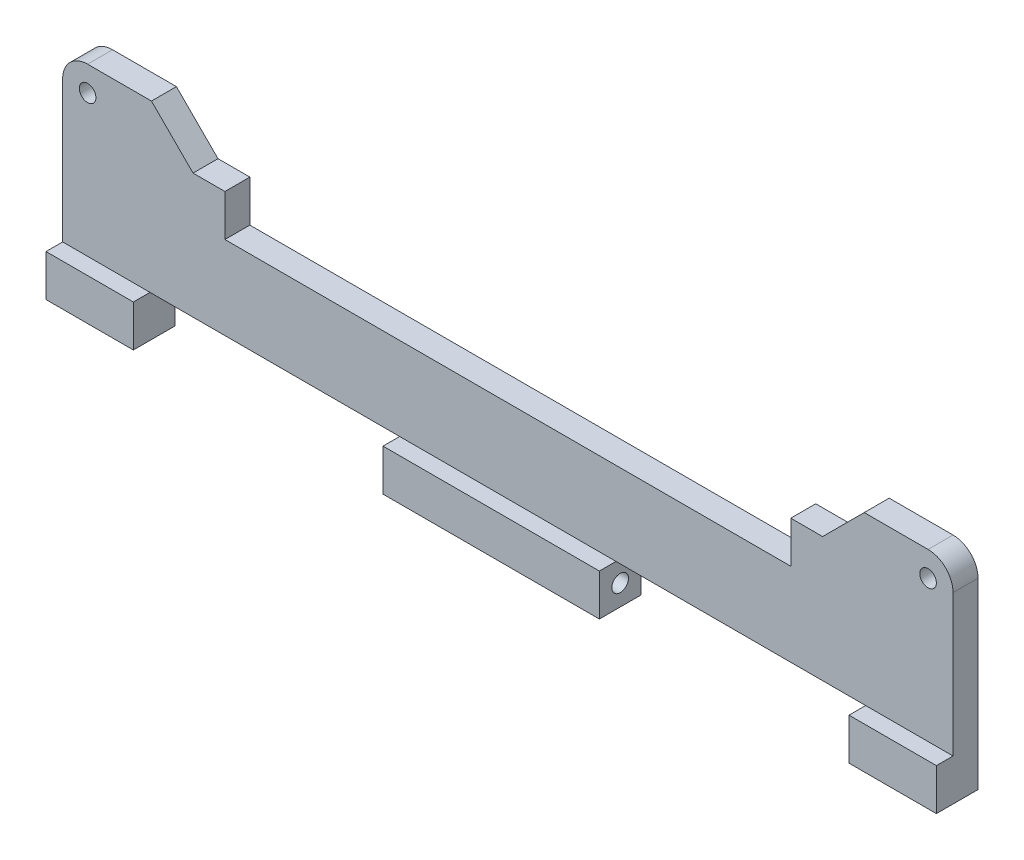
ISO-10303-21;
HEADER;
FILE_DESCRIPTION(('STEP AP214'),'2;1');
FILE_NAME('part.step','',(''),(''),'','','');
FILE_SCHEMA(('AUTOMOTIVE_DESIGN { 1 0 10303 214 1 1 1 1 }'));
ENDSEC;
DATA;
#1=APPLICATION_CONTEXT('core data for automotive mechanical design processes');
#2=APPLICATION_PROTOCOL_DEFINITION('international standard','automotive_design',2000,#1);
#3=PRODUCT_CONTEXT('',#1,'mechanical');
#4=PRODUCT('Part','Part','',(#3));
#5=PRODUCT_RELATED_PRODUCT_CATEGORY('part','',(#4));
#6=PRODUCT_DEFINITION_FORMATION('','',#4);
#7=PRODUCT_DEFINITION_CONTEXT('part definition',#1,'design');
#8=PRODUCT_DEFINITION('design','',#6,#7);
#9=PRODUCT_DEFINITION_SHAPE('','',#8);
#10=(LENGTH_UNIT() NAMED_UNIT(*) SI_UNIT(.MILLI.,.METRE.));
#11=(NAMED_UNIT(*) PLANE_ANGLE_UNIT() SI_UNIT($,.RADIAN.));
#12=(NAMED_UNIT(*) SI_UNIT($,.STERADIAN.) SOLID_ANGLE_UNIT());
#13=UNCERTAINTY_MEASURE_WITH_UNIT(LENGTH_MEASURE(1.E-05),#10,'distance_accuracy_value','');
#14=(GEOMETRIC_REPRESENTATION_CONTEXT(3) GLOBAL_UNCERTAINTY_ASSIGNED_CONTEXT((#13)) GLOBAL_UNIT_ASSIGNED_CONTEXT((#10,
#11,#12)) REPRESENTATION_CONTEXT('',''));
#15=CARTESIAN_POINT('',(0.,0.,0.));
#16=DIRECTION('',(0.,0.,1.));
#17=DIRECTION('',(1.,0.,0.));
#18=AXIS2_PLACEMENT_3D('',#15,#16,#17);
#19=CARTESIAN_POINT('',(-16.5,10.,5.));
#20=DIRECTION('',(0.,-1.,0.));
#21=DIRECTION('',(0.,0.,-1.));
#22=AXIS2_PLACEMENT_3D('',#19,#20,#21);
#23=PLANE('',#22);
#24=DIRECTION('',(-1.,0.,0.));
#25=VECTOR('',#24,1.);
#26=CARTESIAN_POINT('',(-16.5,10.,0.));
#27=LINE('',#26,#25);
#28=CARTESIAN_POINT('',(74.8269189439482,10.,0.));
#29=VERTEX_POINT('',#28);
#30=CARTESIAN_POINT('',(71.,10.,0.));
#31=VERTEX_POINT('',#30);
#32=EDGE_CURVE('E379',#29,#31,#27,.T.);
#33=ORIENTED_EDGE('',*,*,#32,.T.);
#34=DIRECTION('',(0.,0.,-1.));
#35=VECTOR('',#34,1.);
#36=CARTESIAN_POINT('',(71.,10.,3.));
#37=LINE('',#36,#35);
#38=CARTESIAN_POINT('',(71.,10.,3.));
#39=VERTEX_POINT('',#38);
#40=EDGE_CURVE('E215',#39,#31,#37,.T.);
#41=ORIENTED_EDGE('',*,*,#40,.F.);
#42=DIRECTION('',(-1.,0.,0.));
#43=VECTOR('',#42,1.);
#44=CARTESIAN_POINT('',(0.,10.,3.));
#45=LINE('',#44,#43);
#46=CARTESIAN_POINT('',(74.8269189439482,10.,3.));
#47=VERTEX_POINT('',#46);
#48=EDGE_CURVE('E356',#47,#39,#45,.T.);
#49=ORIENTED_EDGE('',*,*,#48,.F.);
#50=DIRECTION('',(0.,0.,-1.));
#51=VECTOR('',#50,1.);
#52=CARTESIAN_POINT('',(74.8269189439482,10.,5.));
#53=LINE('',#52,#51);
#54=EDGE_CURVE('E376',#47,#29,#53,.T.);
#55=ORIENTED_EDGE('',*,*,#54,.T.);
#56=EDGE_LOOP('',(#33,#41,#49,#55));
#57=FACE_BOUND('',#56,.T.);
#58=ADVANCED_FACE('F35',(#57),#23,.F.);
#59=CARTESIAN_POINT('',(0.,0.,0.));
#60=DIRECTION('',(0.,0.,-1.));
#61=DIRECTION('',(-1.,0.,0.));
#62=AXIS2_PLACEMENT_3D('',#59,#60,#61);
#63=PLANE('',#62);
#64=DIRECTION('',(0.,1.,0.));
#65=VECTOR('',#64,1.);
#66=CARTESIAN_POINT('',(71.,5.,0.));
#67=LINE('',#66,#65);
#68=CARTESIAN_POINT('',(71.,5.,0.));
#69=VERTEX_POINT('',#68);
#70=EDGE_CURVE('E209',#69,#31,#67,.T.);
#71=ORIENTED_EDGE('',*,*,#70,.T.);
#72=ORIENTED_EDGE('',*,*,#32,.F.);
#73=DIRECTION('',(0.707106781186544,0.707106781186552,0.));
#74=VECTOR('',#73,1.);
#75=CARTESIAN_POINT('',(74.8269189439482,10.,0.));
#76=LINE('',#75,#74);
#77=CARTESIAN_POINT('',(79.8269189439482,15.,0.));
#78=VERTEX_POINT('',#77);
#79=EDGE_CURVE('E373',#29,#78,#76,.T.);
#80=ORIENTED_EDGE('',*,*,#79,.T.);
#81=DIRECTION('',(1.,0.,0.));
#82=VECTOR('',#81,1.);
#83=CARTESIAN_POINT('',(90.5,15.,0.));
#84=LINE('',#83,#82);
#85=CARTESIAN_POINT('',(87.5,15.,0.));
#86=VERTEX_POINT('',#85);
#87=EDGE_CURVE('E251',#78,#86,#84,.T.);
#88=ORIENTED_EDGE('',*,*,#87,.T.);
#89=CARTESIAN_POINT('',(87.5,12.,0.));
#90=DIRECTION('',(0.,0.,-1.));
#91=DIRECTION('',(-1.,0.,0.));
#92=AXIS2_PLACEMENT_3D('',#89,#90,#91);
#93=CIRCLE('',#92,3.);
#94=CARTESIAN_POINT('',(90.5,12.,0.));
#95=VERTEX_POINT('',#94);
#96=EDGE_CURVE('E11',#86,#95,#93,.T.);
#97=ORIENTED_EDGE('',*,*,#96,.T.);
#98=DIRECTION('',(0.,-1.,0.));
#99=VECTOR('',#98,1.);
#100=CARTESIAN_POINT('',(90.5,-10.,0.));
#101=LINE('',#100,#99);
#102=CARTESIAN_POINT('',(90.5,-10.,0.));
#103=VERTEX_POINT('',#102);
#104=EDGE_CURVE('E269',#95,#103,#101,.T.);
#105=ORIENTED_EDGE('',*,*,#104,.T.);
#106=DIRECTION('',(-1.,0.,0.));
#107=VECTOR('',#106,1.);
#108=CARTESIAN_POINT('',(90.5,-10.,0.));
#109=LINE('',#108,#107);
#110=CARTESIAN_POINT('',(80.,-10.,0.));
#111=VERTEX_POINT('',#110);
#112=EDGE_CURVE('E273',#103,#111,#109,.T.);
#113=ORIENTED_EDGE('',*,*,#112,.T.);
#114=DIRECTION('',(0.,1.,0.));
#115=VECTOR('',#114,1.);
#116=CARTESIAN_POINT('',(80.,-10.,0.));
#117=LINE('',#116,#115);
#118=CARTESIAN_POINT('',(80.,-5.,0.));
#119=VERTEX_POINT('',#118);
#120=EDGE_CURVE('E284',#111,#119,#117,.T.);
#121=ORIENTED_EDGE('',*,*,#120,.T.);
#122=DIRECTION('',(-1.,0.,0.));
#123=VECTOR('',#122,1.);
#124=CARTESIAN_POINT('',(80.,-5.,0.));
#125=LINE('',#124,#123);
#126=CARTESIAN_POINT('',(50.,-5.,0.));
#127=VERTEX_POINT('',#126);
#128=EDGE_CURVE('E281',#119,#127,#125,.T.);
#129=ORIENTED_EDGE('',*,*,#128,.T.);
#130=DIRECTION('',(0.,1.,0.));
#131=VECTOR('',#130,1.);
#132=CARTESIAN_POINT('',(50.,-10.,0.));
#133=LINE('',#132,#131);
#134=CARTESIAN_POINT('',(50.,-10.,0.));
#135=VERTEX_POINT('',#134);
#136=EDGE_CURVE('E323',#135,#127,#133,.T.);
#137=ORIENTED_EDGE('',*,*,#136,.F.);
#138=DIRECTION('',(1.,0.,0.));
#139=VECTOR('',#138,1.);
#140=CARTESIAN_POINT('',(24.,-10.,0.));
#141=LINE('',#140,#139);
#142=CARTESIAN_POINT('',(24.,-10.,0.));
#143=VERTEX_POINT('',#142);
#144=EDGE_CURVE('E321',#143,#135,#141,.T.);
#145=ORIENTED_EDGE('',*,*,#144,.F.);
#146=DIRECTION('',(0.,1.,0.));
#147=VECTOR('',#146,1.);
#148=CARTESIAN_POINT('',(24.,-10.,0.));
#149=LINE('',#148,#147);
#150=CARTESIAN_POINT('',(24.,-5.,0.));
#151=VERTEX_POINT('',#150);
#152=EDGE_CURVE('E333',#143,#151,#149,.T.);
#153=ORIENTED_EDGE('',*,*,#152,.T.);
#154=DIRECTION('',(1.,0.,0.));
#155=VECTOR('',#154,1.);
#156=CARTESIAN_POINT('',(-6.,-5.,0.));
#157=LINE('',#156,#155);
#158=CARTESIAN_POINT('',(-6.,-5.,0.));
#159=VERTEX_POINT('',#158);
#160=EDGE_CURVE('E384',#159,#151,#157,.T.);
#161=ORIENTED_EDGE('',*,*,#160,.F.);
#162=DIRECTION('',(0.,1.,0.));
#163=VECTOR('',#162,1.);
#164=CARTESIAN_POINT('',(-6.,-10.,0.));
#165=LINE('',#164,#163);
#166=CARTESIAN_POINT('',(-6.,-10.,0.));
#167=VERTEX_POINT('',#166);
#168=EDGE_CURVE('E505',#167,#159,#165,.T.);
#169=ORIENTED_EDGE('',*,*,#168,.F.);
#170=DIRECTION('',(1.,0.,0.));
#171=VECTOR('',#170,1.);
#172=CARTESIAN_POINT('',(-16.5,-10.,0.));
#173=LINE('',#172,#171);
#174=CARTESIAN_POINT('',(-16.5,-10.,0.));
#175=VERTEX_POINT('',#174);
#176=EDGE_CURVE('E496',#175,#167,#173,.T.);
#177=ORIENTED_EDGE('',*,*,#176,.F.);
#178=DIRECTION('',(0.,-1.,0.));
#179=VECTOR('',#178,1.);
#180=CARTESIAN_POINT('',(-16.5,-10.,0.));
#181=LINE('',#180,#179);
#182=CARTESIAN_POINT('',(-16.5,12.,0.));
#183=VERTEX_POINT('',#182);
#184=EDGE_CURVE('E491',#183,#175,#181,.T.);
#185=ORIENTED_EDGE('',*,*,#184,.F.);
#186=CARTESIAN_POINT('',(-13.5,12.,0.));
#187=DIRECTION('',(0.,0.,-1.));
#188=DIRECTION('',(-1.,0.,0.));
#189=AXIS2_PLACEMENT_3D('',#186,#187,#188);
#190=CIRCLE('',#189,3.);
#191=CARTESIAN_POINT('',(-13.5,15.,0.));
#192=VERTEX_POINT('',#191);
#193=EDGE_CURVE('E378',#183,#192,#190,.T.);
#194=ORIENTED_EDGE('',*,*,#193,.T.);
#195=DIRECTION('',(-1.,0.,0.));
#196=VECTOR('',#195,1.);
#197=CARTESIAN_POINT('',(-16.5,15.,0.));
#198=LINE('',#197,#196);
#199=CARTESIAN_POINT('',(-5.82691894394815,15.,0.));
#200=VERTEX_POINT('',#199);
#201=EDGE_CURVE('E303',#200,#192,#198,.T.);
#202=ORIENTED_EDGE('',*,*,#201,.F.);
#203=DIRECTION('',(-0.707106781186544,0.707106781186551,0.));
#204=VECTOR('',#203,1.);
#205=CARTESIAN_POINT('',(-10.8269189439483,20.0000000000002,0.));
#206=LINE('',#205,#204);
#207=CARTESIAN_POINT('',(-0.826918943948207,10.,0.));
#208=VERTEX_POINT('',#207);
#209=EDGE_CURVE('E402',#200,#208,#206,.F.);
#210=ORIENTED_EDGE('',*,*,#209,.T.);
#211=CARTESIAN_POINT('',(2.99999999999998,10.,0.));
#212=VERTEX_POINT('',#211);
#213=EDGE_CURVE('E39',#212,#208,#27,.T.);
#214=ORIENTED_EDGE('',*,*,#213,.F.);
#215=DIRECTION('',(0.,1.,0.));
#216=VECTOR('',#215,1.);
#217=CARTESIAN_POINT('',(2.99999999999998,5.,0.));
#218=LINE('',#217,#216);
#219=CARTESIAN_POINT('',(2.99999999999998,5.,0.));
#220=VERTEX_POINT('',#219);
#221=EDGE_CURVE('E53',#220,#212,#218,.T.);
#222=ORIENTED_EDGE('',*,*,#221,.F.);
#223=DIRECTION('',(-1.,0.,0.));
#224=VECTOR('',#223,1.);
#225=CARTESIAN_POINT('',(2.99999999999998,5.,0.));
#226=LINE('',#225,#224);
#227=EDGE_CURVE('E226',#69,#220,#226,.T.);
#228=ORIENTED_EDGE('',*,*,#227,.F.);
#229=EDGE_LOOP('',(#71,#72,#80,#88,#97,#105,#113,#121,#129,#137,#145,#153,#161,#169,#177,#185,
#194,#202,#210,#214,#222,#228));
#230=FACE_BOUND('',#229,.T.);
#231=CARTESIAN_POINT('',(-13.5,12.,0.));
#232=DIRECTION('',(0.,0.,-1.));
#233=DIRECTION('',(-1.,0.,0.));
#234=AXIS2_PLACEMENT_3D('',#231,#232,#233);
#235=CIRCLE('',#234,1.);
#236=CARTESIAN_POINT('',(-14.5,12.,0.));
#237=VERTEX_POINT('',#236);
#238=EDGE_CURVE('E297',#237,#237,#235,.T.);
#239=ORIENTED_EDGE('',*,*,#238,.F.);
#240=EDGE_LOOP('',(#239));
#241=FACE_BOUND('',#240,.T.);
#242=CARTESIAN_POINT('',(87.5,12.,0.));
#243=DIRECTION('',(0.,0.,1.));
#244=DIRECTION('',(1.,0.,0.));
#245=AXIS2_PLACEMENT_3D('',#242,#243,#244);
#246=CIRCLE('',#245,1.);
#247=CARTESIAN_POINT('',(88.5,12.,0.));
#248=VERTEX_POINT('',#247);
#249=EDGE_CURVE('E243',#248,#248,#246,.T.);
#250=ORIENTED_EDGE('',*,*,#249,.T.);
#251=EDGE_LOOP('',(#250));
#252=FACE_BOUND('',#251,.T.);
#253=ADVANCED_FACE('F231',(#230,#241,#252),#63,.T.);
#254=CARTESIAN_POINT('',(0.,0.,3.));
#255=DIRECTION('',(0.,0.,1.));
#256=DIRECTION('',(1.,0.,0.));
#257=AXIS2_PLACEMENT_3D('',#254,#255,#256);
#258=PLANE('',#257);
#259=DIRECTION('',(0.,1.,0.));
#260=VECTOR('',#259,1.);
#261=CARTESIAN_POINT('',(71.,5.,3.));
#262=LINE('',#261,#260);
#263=CARTESIAN_POINT('',(71.,5.,3.));
#264=VERTEX_POINT('',#263);
#265=EDGE_CURVE('E241',#264,#39,#262,.T.);
#266=ORIENTED_EDGE('',*,*,#265,.F.);
#267=DIRECTION('',(1.,0.,0.));
#268=VECTOR('',#267,1.);
#269=CARTESIAN_POINT('',(2.99999999999998,5.,3.));
#270=LINE('',#269,#268);
#271=CARTESIAN_POINT('',(2.99999999999998,5.,3.));
#272=VERTEX_POINT('',#271);
#273=EDGE_CURVE('E220',#272,#264,#270,.T.);
#274=ORIENTED_EDGE('',*,*,#273,.F.);
#275=DIRECTION('',(0.,1.,0.));
#276=VECTOR('',#275,1.);
#277=CARTESIAN_POINT('',(2.99999999999998,5.,3.));
#278=LINE('',#277,#276);
#279=CARTESIAN_POINT('',(2.99999999999998,10.,3.));
#280=VERTEX_POINT('',#279);
#281=EDGE_CURVE('E244',#272,#280,#278,.T.);
#282=ORIENTED_EDGE('',*,*,#281,.T.);
#283=CARTESIAN_POINT('',(-0.8269189439482,10.,3.));
#284=VERTEX_POINT('',#283);
#285=EDGE_CURVE('E349',#280,#284,#45,.T.);
#286=ORIENTED_EDGE('',*,*,#285,.T.);
#287=DIRECTION('',(0.707106781186544,-0.707106781186551,0.));
#288=VECTOR('',#287,1.);
#289=CARTESIAN_POINT('',(-10.8269189439483,20.0000000000002,3.));
#290=LINE('',#289,#288);
#291=CARTESIAN_POINT('',(-5.82691894394815,15.,3.));
#292=VERTEX_POINT('',#291);
#293=EDGE_CURVE('E405',#284,#292,#290,.F.);
#294=ORIENTED_EDGE('',*,*,#293,.T.);
#295=DIRECTION('',(1.,0.,0.));
#296=VECTOR('',#295,1.);
#297=CARTESIAN_POINT('',(-16.5,15.,3.));
#298=LINE('',#297,#296);
#299=CARTESIAN_POINT('',(-13.5,15.,3.));
#300=VERTEX_POINT('',#299);
#301=EDGE_CURVE('E301',#300,#292,#298,.T.);
#302=ORIENTED_EDGE('',*,*,#301,.F.);
#303=CARTESIAN_POINT('',(-13.5,12.,3.));
#304=DIRECTION('',(0.,0.,1.));
#305=DIRECTION('',(1.,0.,0.));
#306=AXIS2_PLACEMENT_3D('',#303,#304,#305);
#307=CIRCLE('',#306,3.);
#308=CARTESIAN_POINT('',(-16.5,12.,3.));
#309=VERTEX_POINT('',#308);
#310=EDGE_CURVE('E411',#300,#309,#307,.T.);
#311=ORIENTED_EDGE('',*,*,#310,.T.);
#312=DIRECTION('',(0.,-1.,0.));
#313=VECTOR('',#312,1.);
#314=CARTESIAN_POINT('',(-16.5,0.,3.));
#315=LINE('',#314,#313);
#316=CARTESIAN_POINT('',(-16.5,-5.,3.));
#317=VERTEX_POINT('',#316);
#318=EDGE_CURVE('E343',#309,#317,#315,.T.);
#319=ORIENTED_EDGE('',*,*,#318,.T.);
#320=DIRECTION('',(1.,0.,0.));
#321=VECTOR('',#320,1.);
#322=CARTESIAN_POINT('',(0.,-5.,3.));
#323=LINE('',#322,#321);
#324=CARTESIAN_POINT('',(-6.,-5.,3.));
#325=VERTEX_POINT('',#324);
#326=EDGE_CURVE('E346',#317,#325,#323,.T.);
#327=ORIENTED_EDGE('',*,*,#326,.T.);
#328=CARTESIAN_POINT('',(24.,-5.,3.));
#329=VERTEX_POINT('',#328);
#330=EDGE_CURVE('E350',#325,#329,#323,.T.);
#331=ORIENTED_EDGE('',*,*,#330,.T.);
#332=CARTESIAN_POINT('',(50.,-5.,3.));
#333=VERTEX_POINT('',#332);
#334=EDGE_CURVE('E345',#329,#333,#323,.T.);
#335=ORIENTED_EDGE('',*,*,#334,.T.);
#336=DIRECTION('',(-1.,0.,0.));
#337=VECTOR('',#336,1.);
#338=CARTESIAN_POINT('',(74.,-5.,3.));
#339=LINE('',#338,#337);
#340=CARTESIAN_POINT('',(80.,-5.,3.));
#341=VERTEX_POINT('',#340);
#342=EDGE_CURVE('E258',#341,#333,#339,.T.);
#343=ORIENTED_EDGE('',*,*,#342,.F.);
#344=CARTESIAN_POINT('',(90.5,-5.,3.));
#345=VERTEX_POINT('',#344);
#346=EDGE_CURVE('E259',#345,#341,#339,.T.);
#347=ORIENTED_EDGE('',*,*,#346,.F.);
#348=DIRECTION('',(0.,-1.,0.));
#349=VECTOR('',#348,1.);
#350=CARTESIAN_POINT('',(90.5,0.,3.));
#351=LINE('',#350,#349);
#352=CARTESIAN_POINT('',(90.5,12.,3.));
#353=VERTEX_POINT('',#352);
#354=EDGE_CURVE('E256',#353,#345,#351,.T.);
#355=ORIENTED_EDGE('',*,*,#354,.F.);
#356=CARTESIAN_POINT('',(87.5,12.,3.));
#357=DIRECTION('',(0.,0.,1.));
#358=DIRECTION('',(1.,0.,0.));
#359=AXIS2_PLACEMENT_3D('',#356,#357,#358);
#360=CIRCLE('',#359,3.);
#361=CARTESIAN_POINT('',(87.5,15.,3.));
#362=VERTEX_POINT('',#361);
#363=EDGE_CURVE('E363',#353,#362,#360,.T.);
#364=ORIENTED_EDGE('',*,*,#363,.T.);
#365=DIRECTION('',(-1.,0.,0.));
#366=VECTOR('',#365,1.);
#367=CARTESIAN_POINT('',(90.5,15.,3.));
#368=LINE('',#367,#366);
#369=CARTESIAN_POINT('',(79.8269189439482,15.,3.));
#370=VERTEX_POINT('',#369);
#371=EDGE_CURVE('E253',#362,#370,#368,.T.);
#372=ORIENTED_EDGE('',*,*,#371,.T.);
#373=DIRECTION('',(-0.707106781186544,-0.707106781186552,0.));
#374=VECTOR('',#373,1.);
#375=CARTESIAN_POINT('',(74.8269189439482,10.,3.));
#376=LINE('',#375,#374);
#377=EDGE_CURVE('E368',#370,#47,#376,.T.);
#378=ORIENTED_EDGE('',*,*,#377,.T.);
#379=ORIENTED_EDGE('',*,*,#48,.T.);
#380=EDGE_LOOP('',(#266,#274,#282,#286,#294,#302,#311,#319,#327,#331,#335,#343,#347,#355,#364,
#372,#378,#379));
#381=FACE_BOUND('',#380,.T.);
#382=CARTESIAN_POINT('',(-13.5,12.,3.));
#383=DIRECTION('',(0.,0.,1.));
#384=DIRECTION('',(1.,0.,0.));
#385=AXIS2_PLACEMENT_3D('',#382,#383,#384);
#386=CIRCLE('',#385,1.);
#387=CARTESIAN_POINT('',(-12.5,12.,3.));
#388=VERTEX_POINT('',#387);
#389=EDGE_CURVE('E300',#388,#388,#386,.T.);
#390=ORIENTED_EDGE('',*,*,#389,.F.);
#391=EDGE_LOOP('',(#390));
#392=FACE_BOUND('',#391,.T.);
#393=CARTESIAN_POINT('',(87.5,12.,3.));
#394=DIRECTION('',(0.,0.,1.));
#395=DIRECTION('',(1.,0.,0.));
#396=AXIS2_PLACEMENT_3D('',#393,#394,#395);
#397=CIRCLE('',#396,1.);
#398=CARTESIAN_POINT('',(88.5,12.,3.));
#399=VERTEX_POINT('',#398);
#400=EDGE_CURVE('E250',#399,#399,#397,.F.);
#401=ORIENTED_EDGE('',*,*,#400,.T.);
#402=EDGE_LOOP('',(#401));
#403=FACE_BOUND('',#402,.T.);
#404=ADVANCED_FACE('F421',(#381,#392,#403),#258,.T.);
#405=ORIENTED_EDGE('',*,*,#285,.F.);
#406=DIRECTION('',(0.,0.,1.));
#407=VECTOR('',#406,1.);
#408=CARTESIAN_POINT('',(2.99999999999998,10.,3.));
#409=LINE('',#408,#407);
#410=EDGE_CURVE('E229',#212,#280,#409,.T.);
#411=ORIENTED_EDGE('',*,*,#410,.F.);
#412=ORIENTED_EDGE('',*,*,#213,.T.);
#413=DIRECTION('',(0.,0.,1.));
#414=VECTOR('',#413,1.);
#415=CARTESIAN_POINT('',(-0.8269189439482,10.,3.));
#416=LINE('',#415,#414);
#417=EDGE_CURVE('E396',#208,#284,#416,.T.);
#418=ORIENTED_EDGE('',*,*,#417,.T.);
#419=EDGE_LOOP('',(#405,#411,#412,#418));
#420=FACE_BOUND('',#419,.T.);
#421=ADVANCED_FACE('F424',(#420),#23,.F.);
#422=CARTESIAN_POINT('',(24.,-10.,5.));
#423=DIRECTION('',(0.,0.,-1.));
#424=DIRECTION('',(-1.,0.,0.));
#425=AXIS2_PLACEMENT_3D('',#422,#423,#424);
#426=PLANE('',#425);
#427=DIRECTION('',(0.,1.,0.));
#428=VECTOR('',#427,1.);
#429=CARTESIAN_POINT('',(50.,-10.,5.));
#430=LINE('',#429,#428);
#431=CARTESIAN_POINT('',(50.,-10.,5.));
#432=VERTEX_POINT('',#431);
#433=CARTESIAN_POINT('',(50.,-5.,5.));
#434=VERTEX_POINT('',#433);
#435=EDGE_CURVE('E339',#432,#434,#430,.T.);
#436=ORIENTED_EDGE('',*,*,#435,.T.);
#437=DIRECTION('',(-1.,0.,0.));
#438=VECTOR('',#437,1.);
#439=CARTESIAN_POINT('',(24.,-5.,5.));
#440=LINE('',#439,#438);
#441=CARTESIAN_POINT('',(24.,-5.,5.));
#442=VERTEX_POINT('',#441);
#443=EDGE_CURVE('E326',#434,#442,#440,.T.);
#444=ORIENTED_EDGE('',*,*,#443,.T.);
#445=DIRECTION('',(0.,1.,0.));
#446=VECTOR('',#445,1.);
#447=CARTESIAN_POINT('',(24.,-10.,5.));
#448=LINE('',#447,#446);
#449=CARTESIAN_POINT('',(24.,-10.,5.));
#450=VERTEX_POINT('',#449);
#451=EDGE_CURVE('E336',#450,#442,#448,.T.);
#452=ORIENTED_EDGE('',*,*,#451,.F.);
#453=DIRECTION('',(-1.,0.,0.));
#454=VECTOR('',#453,1.);
#455=CARTESIAN_POINT('',(24.,-10.,5.));
#456=LINE('',#455,#454);
#457=EDGE_CURVE('E316',#432,#450,#456,.T.);
#458=ORIENTED_EDGE('',*,*,#457,.F.);
#459=EDGE_LOOP('',(#436,#444,#452,#458));
#460=FACE_BOUND('',#459,.T.);
#461=ADVANCED_FACE('F447',(#460),#426,.F.);
#462=DIRECTION('',(-1.,0.,0.));
#463=VECTOR('',#462,1.);
#464=CARTESIAN_POINT('',(74.,-5.,5.));
#465=LINE('',#464,#463);
#466=CARTESIAN_POINT('',(90.5,-5.,5.));
#467=VERTEX_POINT('',#466);
#468=CARTESIAN_POINT('',(80.,-5.,5.));
#469=VERTEX_POINT('',#468);
#470=EDGE_CURVE('E255',#467,#469,#465,.T.);
#471=ORIENTED_EDGE('',*,*,#470,.T.);
#472=DIRECTION('',(0.,1.,0.));
#473=VECTOR('',#472,1.);
#474=CARTESIAN_POINT('',(80.,-10.,5.));
#475=LINE('',#474,#473);
#476=CARTESIAN_POINT('',(80.,-10.,5.));
#477=VERTEX_POINT('',#476);
#478=EDGE_CURVE('E272',#477,#469,#475,.T.);
#479=ORIENTED_EDGE('',*,*,#478,.F.);
#480=DIRECTION('',(-1.,0.,0.));
#481=VECTOR('',#480,1.);
#482=CARTESIAN_POINT('',(90.5,-10.,5.));
#483=LINE('',#482,#481);
#484=CARTESIAN_POINT('',(90.5,-10.,5.));
#485=VERTEX_POINT('',#484);
#486=EDGE_CURVE('E276',#485,#477,#483,.T.);
#487=ORIENTED_EDGE('',*,*,#486,.F.);
#488=DIRECTION('',(0.,-1.,0.));
#489=VECTOR('',#488,1.);
#490=CARTESIAN_POINT('',(90.5,-10.,5.));
#491=LINE('',#490,#489);
#492=EDGE_CURVE('E270',#467,#485,#491,.T.);
#493=ORIENTED_EDGE('',*,*,#492,.F.);
#494=EDGE_LOOP('',(#471,#479,#487,#493));
#495=FACE_BOUND('',#494,.T.);
#496=ADVANCED_FACE('F542',(#495),#426,.F.);
#497=CARTESIAN_POINT('',(80.,-5.,5.));
#498=DIRECTION('',(0.,-1.,0.));
#499=DIRECTION('',(0.,0.,-1.));
#500=AXIS2_PLACEMENT_3D('',#497,#498,#499);
#501=PLANE('',#500);
#502=DIRECTION('',(0.,0.,-1.));
#503=VECTOR('',#502,1.);
#504=CARTESIAN_POINT('',(80.,-5.,5.));
#505=LINE('',#504,#503);
#506=EDGE_CURVE('E293',#341,#119,#505,.T.);
#507=ORIENTED_EDGE('',*,*,#506,.F.);
#508=ORIENTED_EDGE('',*,*,#342,.T.);
#509=DIRECTION('',(0.,0.,1.));
#510=VECTOR('',#509,1.);
#511=CARTESIAN_POINT('',(50.,-5.,0.));
#512=LINE('',#511,#510);
#513=EDGE_CURVE('E312',#127,#333,#512,.T.);
#514=ORIENTED_EDGE('',*,*,#513,.F.);
#515=ORIENTED_EDGE('',*,*,#128,.F.);
#516=EDGE_LOOP('',(#507,#508,#514,#515));
#517=FACE_BOUND('',#516,.T.);
#518=ADVANCED_FACE('F539',(#517),#501,.T.);
#519=CARTESIAN_POINT('',(90.5,-10.,5.));
#520=DIRECTION('',(1.,0.,0.));
#521=DIRECTION('',(0.,0.,-1.));
#522=AXIS2_PLACEMENT_3D('',#519,#520,#521);
#523=PLANE('',#522);
#524=ORIENTED_EDGE('',*,*,#104,.F.);
#525=DIRECTION('',(0.,0.,1.));
#526=VECTOR('',#525,1.);
#527=CARTESIAN_POINT('',(90.5,12.,5.));
#528=LINE('',#527,#526);
#529=EDGE_CURVE('E365',#95,#353,#528,.T.);
#530=ORIENTED_EDGE('',*,*,#529,.T.);
#531=ORIENTED_EDGE('',*,*,#354,.T.);
#532=DIRECTION('',(0.,0.,1.));
#533=VECTOR('',#532,1.);
#534=CARTESIAN_POINT('',(90.5,-5.,3.));
#535=LINE('',#534,#533);
#536=EDGE_CURVE('E261',#345,#467,#535,.T.);
#537=ORIENTED_EDGE('',*,*,#536,.T.);
#538=ORIENTED_EDGE('',*,*,#492,.T.);
#539=DIRECTION('',(0.,0.,-1.));
#540=VECTOR('',#539,1.);
#541=CARTESIAN_POINT('',(90.5,-10.,5.));
#542=LINE('',#541,#540);
#543=EDGE_CURVE('E279',#485,#103,#542,.T.);
#544=ORIENTED_EDGE('',*,*,#543,.T.);
#545=EDGE_LOOP('',(#524,#530,#531,#537,#538,#544));
#546=FACE_BOUND('',#545,.T.);
#547=ADVANCED_FACE('F453',(#546),#523,.T.);
#548=CARTESIAN_POINT('',(-6.,-5.,5.));
#549=DIRECTION('',(0.,1.,0.));
#550=DIRECTION('',(0.,0.,1.));
#551=AXIS2_PLACEMENT_3D('',#548,#549,#550);
#552=PLANE('',#551);
#553=DIRECTION('',(0.,0.,-1.));
#554=VECTOR('',#553,1.);
#555=CARTESIAN_POINT('',(24.,-5.,0.));
#556=LINE('',#555,#554);
#557=EDGE_CURVE('E328',#329,#151,#556,.T.);
#558=ORIENTED_EDGE('',*,*,#557,.F.);
#559=ORIENTED_EDGE('',*,*,#330,.F.);
#560=DIRECTION('',(0.,0.,-1.));
#561=VECTOR('',#560,1.);
#562=CARTESIAN_POINT('',(-6.,-5.,5.));
#563=LINE('',#562,#561);
#564=EDGE_CURVE('E390',#325,#159,#563,.T.);
#565=ORIENTED_EDGE('',*,*,#564,.T.);
#566=ORIENTED_EDGE('',*,*,#160,.T.);
#567=EDGE_LOOP('',(#558,#559,#565,#566));
#568=FACE_BOUND('',#567,.T.);
#569=ADVANCED_FACE('F449',(#568),#552,.F.);
#570=CARTESIAN_POINT('',(-16.5,-10.,5.));
#571=DIRECTION('',(1.,0.,0.));
#572=DIRECTION('',(0.,0.,-1.));
#573=AXIS2_PLACEMENT_3D('',#570,#571,#572);
#574=PLANE('',#573);
#575=ORIENTED_EDGE('',*,*,#318,.F.);
#576=DIRECTION('',(0.,0.,1.));
#577=VECTOR('',#576,1.);
#578=CARTESIAN_POINT('',(-16.5,12.,0.));
#579=LINE('',#578,#577);
#580=EDGE_CURVE('E413',#309,#183,#579,.F.);
#581=ORIENTED_EDGE('',*,*,#580,.T.);
#582=ORIENTED_EDGE('',*,*,#184,.T.);
#583=DIRECTION('',(0.,0.,-1.));
#584=VECTOR('',#583,1.);
#585=CARTESIAN_POINT('',(-16.5,-10.,5.));
#586=LINE('',#585,#584);
#587=CARTESIAN_POINT('',(-16.5,-10.,5.));
#588=VERTEX_POINT('',#587);
#589=EDGE_CURVE('E393',#588,#175,#586,.T.);
#590=ORIENTED_EDGE('',*,*,#589,.F.);
#591=DIRECTION('',(0.,-1.,0.));
#592=VECTOR('',#591,1.);
#593=CARTESIAN_POINT('',(-16.5,-10.,5.));
#594=LINE('',#593,#592);
#595=CARTESIAN_POINT('',(-16.5,-5.,5.));
#596=VERTEX_POINT('',#595);
#597=EDGE_CURVE('E380',#596,#588,#594,.T.);
#598=ORIENTED_EDGE('',*,*,#597,.F.);
#599=DIRECTION('',(0.,0.,1.));
#600=VECTOR('',#599,1.);
#601=CARTESIAN_POINT('',(-16.5,-5.,3.));
#602=LINE('',#601,#600);
#603=EDGE_CURVE('E490',#317,#596,#602,.T.);
#604=ORIENTED_EDGE('',*,*,#603,.F.);
#605=EDGE_LOOP('',(#575,#581,#582,#590,#598,#604));
#606=FACE_BOUND('',#605,.T.);
#607=ADVANCED_FACE('F452',(#606),#574,.F.);
#608=CARTESIAN_POINT('',(-16.5,-10.,5.));
#609=DIRECTION('',(0.,1.,0.));
#610=DIRECTION('',(0.,0.,1.));
#611=AXIS2_PLACEMENT_3D('',#608,#609,#610);
#612=PLANE('',#611);
#613=ORIENTED_EDGE('',*,*,#176,.T.);
#614=DIRECTION('',(0.,0.,-1.));
#615=VECTOR('',#614,1.);
#616=CARTESIAN_POINT('',(-6.,-10.,5.));
#617=LINE('',#616,#615);
#618=CARTESIAN_POINT('',(-6.,-10.,5.));
#619=VERTEX_POINT('',#618);
#620=EDGE_CURVE('E389',#619,#167,#617,.T.);
#621=ORIENTED_EDGE('',*,*,#620,.F.);
#622=DIRECTION('',(1.,0.,0.));
#623=VECTOR('',#622,1.);
#624=CARTESIAN_POINT('',(-16.5,-10.,5.));
#625=LINE('',#624,#623);
#626=EDGE_CURVE('E500',#588,#619,#625,.T.);
#627=ORIENTED_EDGE('',*,*,#626,.F.);
#628=ORIENTED_EDGE('',*,*,#589,.T.);
#629=EDGE_LOOP('',(#613,#621,#627,#628));
#630=FACE_BOUND('',#629,.T.);
#631=ADVANCED_FACE('F458',(#630),#612,.F.);
#632=CARTESIAN_POINT('',(-6.,-10.,5.));
#633=DIRECTION('',(-1.,0.,0.));
#634=DIRECTION('',(0.,0.,1.));
#635=AXIS2_PLACEMENT_3D('',#632,#633,#634);
#636=PLANE('',#635);
#637=ORIENTED_EDGE('',*,*,#168,.T.);
#638=ORIENTED_EDGE('',*,*,#564,.F.);
#639=CARTESIAN_POINT('',(-6.,-5.,5.));
#640=VERTEX_POINT('',#639);
#641=EDGE_CURVE('E386',#640,#325,#563,.T.);
#642=ORIENTED_EDGE('',*,*,#641,.F.);
#643=DIRECTION('',(0.,1.,0.));
#644=VECTOR('',#643,1.);
#645=CARTESIAN_POINT('',(-6.,-10.,5.));
#646=LINE('',#645,#644);
#647=EDGE_CURVE('E502',#619,#640,#646,.T.);
#648=ORIENTED_EDGE('',*,*,#647,.F.);
#649=ORIENTED_EDGE('',*,*,#620,.T.);
#650=EDGE_LOOP('',(#637,#638,#642,#648,#649));
#651=FACE_BOUND('',#650,.T.);
#652=ADVANCED_FACE('F455',(#651),#636,.F.);
#653=CARTESIAN_POINT('',(0.,0.,5.));
#654=DIRECTION('',(0.,0.,-1.));
#655=DIRECTION('',(-1.,0.,0.));
#656=AXIS2_PLACEMENT_3D('',#653,#654,#655);
#657=PLANE('',#656);
#658=ORIENTED_EDGE('',*,*,#647,.T.);
#659=DIRECTION('',(1.,0.,0.));
#660=VECTOR('',#659,1.);
#661=CARTESIAN_POINT('',(0.,-5.,5.));
#662=LINE('',#661,#660);
#663=EDGE_CURVE('E342',#596,#640,#662,.T.);
#664=ORIENTED_EDGE('',*,*,#663,.F.);
#665=ORIENTED_EDGE('',*,*,#597,.T.);
#666=ORIENTED_EDGE('',*,*,#626,.T.);
#667=EDGE_LOOP('',(#658,#664,#665,#666));
#668=FACE_BOUND('',#667,.T.);
#669=ADVANCED_FACE('F443',(#668),#657,.F.);
#670=CARTESIAN_POINT('',(0.,-5.,3.));
#671=DIRECTION('',(0.,-1.,0.));
#672=DIRECTION('',(0.,0.,-1.));
#673=AXIS2_PLACEMENT_3D('',#670,#671,#672);
#674=PLANE('',#673);
#675=ORIENTED_EDGE('',*,*,#326,.F.);
#676=ORIENTED_EDGE('',*,*,#603,.T.);
#677=ORIENTED_EDGE('',*,*,#663,.T.);
#678=ORIENTED_EDGE('',*,*,#641,.T.);
#679=EDGE_LOOP('',(#675,#676,#677,#678));
#680=FACE_BOUND('',#679,.T.);
#681=ADVANCED_FACE('F565',(#680),#674,.F.);
#682=CARTESIAN_POINT('',(0.,-5.,0.));
#683=DIRECTION('',(0.,1.,0.));
#684=DIRECTION('',(0.,0.,1.));
#685=AXIS2_PLACEMENT_3D('',#682,#683,#684);
#686=PLANE('',#685);
#687=ORIENTED_EDGE('',*,*,#443,.F.);
#688=DIRECTION('',(0.,0.,-1.));
#689=VECTOR('',#688,1.);
#690=CARTESIAN_POINT('',(50.,-5.,0.));
#691=LINE('',#690,#689);
#692=EDGE_CURVE('E266',#434,#333,#691,.T.);
#693=ORIENTED_EDGE('',*,*,#692,.T.);
#694=ORIENTED_EDGE('',*,*,#334,.F.);
#695=EDGE_CURVE('E317',#442,#329,#556,.T.);
#696=ORIENTED_EDGE('',*,*,#695,.F.);
#697=EDGE_LOOP('',(#687,#693,#694,#696));
#698=FACE_BOUND('',#697,.T.);
#699=ADVANCED_FACE('F561',(#698),#686,.T.);
#700=CARTESIAN_POINT('',(50.,-10.,0.));
#701=DIRECTION('',(-1.,0.,0.));
#702=DIRECTION('',(0.,0.,1.));
#703=AXIS2_PLACEMENT_3D('',#700,#701,#702);
#704=PLANE('',#703);
#705=CARTESIAN_POINT('',(50.,-7.5,2.5));
#706=DIRECTION('',(1.,0.,0.));
#707=DIRECTION('',(0.,0.,-1.));
#708=AXIS2_PLACEMENT_3D('',#705,#706,#707);
#709=CIRCLE('',#708,1.);
#710=CARTESIAN_POINT('',(50.,-7.5,1.5));
#711=VERTEX_POINT('',#710);
#712=EDGE_CURVE('E309',#711,#711,#709,.T.);
#713=ORIENTED_EDGE('',*,*,#712,.F.);
#714=EDGE_LOOP('',(#713));
#715=FACE_BOUND('',#714,.T.);
#716=ORIENTED_EDGE('',*,*,#513,.T.);
#717=ORIENTED_EDGE('',*,*,#692,.F.);
#718=ORIENTED_EDGE('',*,*,#435,.F.);
#719=DIRECTION('',(0.,0.,1.));
#720=VECTOR('',#719,1.);
#721=CARTESIAN_POINT('',(50.,-10.,0.));
#722=LINE('',#721,#720);
#723=EDGE_CURVE('E313',#135,#432,#722,.T.);
#724=ORIENTED_EDGE('',*,*,#723,.F.);
#725=ORIENTED_EDGE('',*,*,#136,.T.);
#726=EDGE_LOOP('',(#716,#717,#718,#724,#725));
#727=FACE_BOUND('',#726,.T.);
#728=ADVANCED_FACE('F564',(#715,#727),#704,.F.);
#729=CARTESIAN_POINT('',(24.,-10.,0.));
#730=DIRECTION('',(1.,0.,0.));
#731=DIRECTION('',(0.,0.,-1.));
#732=AXIS2_PLACEMENT_3D('',#729,#730,#731);
#733=PLANE('',#732);
#734=CARTESIAN_POINT('',(24.,-7.5,2.5));
#735=DIRECTION('',(1.,0.,0.));
#736=DIRECTION('',(0.,0.,-1.));
#737=AXIS2_PLACEMENT_3D('',#734,#735,#736);
#738=CIRCLE('',#737,1.);
#739=CARTESIAN_POINT('',(24.,-7.5,1.5));
#740=VERTEX_POINT('',#739);
#741=EDGE_CURVE('E306',#740,#740,#738,.F.);
#742=ORIENTED_EDGE('',*,*,#741,.F.);
#743=EDGE_LOOP('',(#742));
#744=FACE_BOUND('',#743,.T.);
#745=ORIENTED_EDGE('',*,*,#695,.T.);
#746=ORIENTED_EDGE('',*,*,#557,.T.);
#747=ORIENTED_EDGE('',*,*,#152,.F.);
#748=DIRECTION('',(0.,0.,-1.));
#749=VECTOR('',#748,1.);
#750=CARTESIAN_POINT('',(24.,-10.,0.));
#751=LINE('',#750,#749);
#752=EDGE_CURVE('E319',#450,#143,#751,.T.);
#753=ORIENTED_EDGE('',*,*,#752,.F.);
#754=ORIENTED_EDGE('',*,*,#451,.T.);
#755=EDGE_LOOP('',(#745,#746,#747,#753,#754));
#756=FACE_BOUND('',#755,.T.);
#757=ADVANCED_FACE('F559',(#744,#756),#733,.F.);
#758=CARTESIAN_POINT('',(0.,-10.,0.));
#759=DIRECTION('',(0.,1.,0.));
#760=DIRECTION('',(0.,0.,1.));
#761=AXIS2_PLACEMENT_3D('',#758,#759,#760);
#762=PLANE('',#761);
#763=ORIENTED_EDGE('',*,*,#723,.T.);
#764=ORIENTED_EDGE('',*,*,#457,.T.);
#765=ORIENTED_EDGE('',*,*,#752,.T.);
#766=ORIENTED_EDGE('',*,*,#144,.T.);
#767=EDGE_LOOP('',(#763,#764,#765,#766));
#768=FACE_BOUND('',#767,.T.);
#769=ADVANCED_FACE('F555',(#768),#762,.F.);
#770=CARTESIAN_POINT('',(-16.501,-7.5,2.5));
#771=DIRECTION('',(1.,0.,0.));
#772=DIRECTION('',(0.,0.,-1.));
#773=AXIS2_PLACEMENT_3D('',#770,#771,#772);
#774=CYLINDRICAL_SURFACE('',#773,1.);
#775=ORIENTED_EDGE('',*,*,#712,.T.);
#776=EDGE_LOOP('',(#775));
#777=FACE_BOUND('',#776,.T.);
#778=ORIENTED_EDGE('',*,*,#741,.T.);
#779=EDGE_LOOP('',(#778));
#780=FACE_BOUND('',#779,.T.);
#781=ADVANCED_FACE('F551',(#777,#780),#774,.F.);
#782=CARTESIAN_POINT('',(0.,15.,0.));
#783=DIRECTION('',(0.,1.,0.));
#784=DIRECTION('',(0.,0.,1.));
#785=AXIS2_PLACEMENT_3D('',#782,#783,#784);
#786=PLANE('',#785);
#787=ORIENTED_EDGE('',*,*,#201,.T.);
#788=DIRECTION('',(0.,0.,1.));
#789=VECTOR('',#788,1.);
#790=CARTESIAN_POINT('',(-13.5,15.,3.));
#791=LINE('',#790,#789);
#792=EDGE_CURVE('E408',#192,#300,#791,.T.);
#793=ORIENTED_EDGE('',*,*,#792,.T.);
#794=ORIENTED_EDGE('',*,*,#301,.T.);
#795=DIRECTION('',(0.,0.,1.));
#796=VECTOR('',#795,1.);
#797=CARTESIAN_POINT('',(-5.82691894394815,15.,0.));
#798=LINE('',#797,#796);
#799=EDGE_CURVE('E399',#292,#200,#798,.F.);
#800=ORIENTED_EDGE('',*,*,#799,.T.);
#801=EDGE_LOOP('',(#787,#793,#794,#800));
#802=FACE_BOUND('',#801,.T.);
#803=ADVANCED_FACE('F470',(#802),#786,.T.);
#804=CARTESIAN_POINT('',(-10.8269189439483,20.0000000000002,0.));
#805=DIRECTION('',(0.707106781186551,0.707106781186544,0.));
#806=DIRECTION('',(0.,0.,1.));
#807=AXIS2_PLACEMENT_3D('',#804,#805,#806);
#808=PLANE('',#807);
#809=ORIENTED_EDGE('',*,*,#293,.F.);
#810=ORIENTED_EDGE('',*,*,#417,.F.);
#811=ORIENTED_EDGE('',*,*,#209,.F.);
#812=ORIENTED_EDGE('',*,*,#799,.F.);
#813=EDGE_LOOP('',(#809,#810,#811,#812));
#814=FACE_BOUND('',#813,.T.);
#815=ADVANCED_FACE('F466',(#814),#808,.T.);
#816=CARTESIAN_POINT('',(-13.5,12.,0.));
#817=DIRECTION('',(0.,0.,-1.));
#818=DIRECTION('',(-1.,0.,0.));
#819=AXIS2_PLACEMENT_3D('',#816,#817,#818);
#820=CYLINDRICAL_SURFACE('',#819,3.);
#821=ORIENTED_EDGE('',*,*,#193,.F.);
#822=ORIENTED_EDGE('',*,*,#580,.F.);
#823=ORIENTED_EDGE('',*,*,#310,.F.);
#824=ORIENTED_EDGE('',*,*,#792,.F.);
#825=EDGE_LOOP('',(#821,#822,#823,#824));
#826=FACE_BOUND('',#825,.T.);
#827=ADVANCED_FACE('F469',(#826),#820,.T.);
#828=CARTESIAN_POINT('',(-13.5,12.,5.));
#829=DIRECTION('',(0.,0.,-1.));
#830=DIRECTION('',(-1.,0.,0.));
#831=AXIS2_PLACEMENT_3D('',#828,#829,#830);
#832=CYLINDRICAL_SURFACE('',#831,1.);
#833=ORIENTED_EDGE('',*,*,#389,.T.);
#834=EDGE_LOOP('',(#833));
#835=FACE_BOUND('',#834,.T.);
#836=ORIENTED_EDGE('',*,*,#238,.T.);
#837=EDGE_LOOP('',(#836));
#838=FACE_BOUND('',#837,.T.);
#839=ADVANCED_FACE('F418',(#835,#838),#832,.F.);
#840=CARTESIAN_POINT('',(80.,-10.,5.));
#841=DIRECTION('',(-1.,0.,0.));
#842=DIRECTION('',(0.,0.,1.));
#843=AXIS2_PLACEMENT_3D('',#840,#841,#842);
#844=PLANE('',#843);
#845=ORIENTED_EDGE('',*,*,#120,.F.);
#846=DIRECTION('',(0.,0.,-1.));
#847=VECTOR('',#846,1.);
#848=CARTESIAN_POINT('',(80.,-10.,5.));
#849=LINE('',#848,#847);
#850=EDGE_CURVE('E291',#477,#111,#849,.T.);
#851=ORIENTED_EDGE('',*,*,#850,.F.);
#852=ORIENTED_EDGE('',*,*,#478,.T.);
#853=EDGE_CURVE('E294',#469,#341,#505,.T.);
#854=ORIENTED_EDGE('',*,*,#853,.T.);
#855=ORIENTED_EDGE('',*,*,#506,.T.);
#856=EDGE_LOOP('',(#845,#851,#852,#854,#855));
#857=FACE_BOUND('',#856,.T.);
#858=ADVANCED_FACE('F534',(#857),#844,.T.);
#859=CARTESIAN_POINT('',(90.5,-10.,5.));
#860=DIRECTION('',(0.,-1.,0.));
#861=DIRECTION('',(0.,0.,-1.));
#862=AXIS2_PLACEMENT_3D('',#859,#860,#861);
#863=PLANE('',#862);
#864=ORIENTED_EDGE('',*,*,#112,.F.);
#865=ORIENTED_EDGE('',*,*,#543,.F.);
#866=ORIENTED_EDGE('',*,*,#486,.T.);
#867=ORIENTED_EDGE('',*,*,#850,.T.);
#868=EDGE_LOOP('',(#864,#865,#866,#867));
#869=FACE_BOUND('',#868,.T.);
#870=ADVANCED_FACE('F530',(#869),#863,.T.);
#871=CARTESIAN_POINT('',(74.,-5.,3.));
#872=DIRECTION('',(0.,1.,0.));
#873=DIRECTION('',(0.,0.,1.));
#874=AXIS2_PLACEMENT_3D('',#871,#872,#873);
#875=PLANE('',#874);
#876=ORIENTED_EDGE('',*,*,#470,.F.);
#877=ORIENTED_EDGE('',*,*,#536,.F.);
#878=ORIENTED_EDGE('',*,*,#346,.T.);
#879=ORIENTED_EDGE('',*,*,#853,.F.);
#880=EDGE_LOOP('',(#876,#877,#878,#879));
#881=FACE_BOUND('',#880,.T.);
#882=ADVANCED_FACE('F483',(#881),#875,.T.);
#883=CARTESIAN_POINT('',(74.,15.,0.));
#884=DIRECTION('',(0.,1.,0.));
#885=DIRECTION('',(0.,0.,1.));
#886=AXIS2_PLACEMENT_3D('',#883,#884,#885);
#887=PLANE('',#886);
#888=ORIENTED_EDGE('',*,*,#371,.F.);
#889=DIRECTION('',(0.,0.,1.));
#890=VECTOR('',#889,1.);
#891=CARTESIAN_POINT('',(87.5,15.,0.));
#892=LINE('',#891,#890);
#893=EDGE_CURVE('E45',#362,#86,#892,.F.);
#894=ORIENTED_EDGE('',*,*,#893,.T.);
#895=ORIENTED_EDGE('',*,*,#87,.F.);
#896=DIRECTION('',(0.,0.,1.));
#897=VECTOR('',#896,1.);
#898=CARTESIAN_POINT('',(79.8269189439482,15.,5.));
#899=LINE('',#898,#897);
#900=EDGE_CURVE('E370',#78,#370,#899,.T.);
#901=ORIENTED_EDGE('',*,*,#900,.T.);
#902=EDGE_LOOP('',(#888,#894,#895,#901));
#903=FACE_BOUND('',#902,.T.);
#904=ADVANCED_FACE('F476',(#903),#887,.T.);
#905=CARTESIAN_POINT('',(74.8269189439482,10.,5.));
#906=DIRECTION('',(0.707106781186552,-0.707106781186544,0.));
#907=DIRECTION('',(0.,0.,-1.));
#908=AXIS2_PLACEMENT_3D('',#905,#906,#907);
#909=PLANE('',#908);
#910=ORIENTED_EDGE('',*,*,#377,.F.);
#911=ORIENTED_EDGE('',*,*,#900,.F.);
#912=ORIENTED_EDGE('',*,*,#79,.F.);
#913=ORIENTED_EDGE('',*,*,#54,.F.);
#914=EDGE_LOOP('',(#910,#911,#912,#913));
#915=FACE_BOUND('',#914,.T.);
#916=ADVANCED_FACE('F474',(#915),#909,.F.);
#917=CARTESIAN_POINT('',(87.5,12.,5.));
#918=DIRECTION('',(0.,0.,1.));
#919=DIRECTION('',(1.,0.,0.));
#920=AXIS2_PLACEMENT_3D('',#917,#918,#919);
#921=CYLINDRICAL_SURFACE('',#920,3.);
#922=ORIENTED_EDGE('',*,*,#96,.F.);
#923=ORIENTED_EDGE('',*,*,#893,.F.);
#924=ORIENTED_EDGE('',*,*,#363,.F.);
#925=ORIENTED_EDGE('',*,*,#529,.F.);
#926=EDGE_LOOP('',(#922,#923,#924,#925));
#927=FACE_BOUND('',#926,.T.);
#928=ADVANCED_FACE('F37',(#927),#921,.T.);
#929=CARTESIAN_POINT('',(87.5,12.,5.));
#930=DIRECTION('',(0.,0.,-1.));
#931=DIRECTION('',(-1.,0.,0.));
#932=AXIS2_PLACEMENT_3D('',#929,#930,#931);
#933=CYLINDRICAL_SURFACE('',#932,1.);
#934=ORIENTED_EDGE('',*,*,#400,.F.);
#935=EDGE_LOOP('',(#934));
#936=FACE_BOUND('',#935,.T.);
#937=ORIENTED_EDGE('',*,*,#249,.F.);
#938=EDGE_LOOP('',(#937));
#939=FACE_BOUND('',#938,.T.);
#940=ADVANCED_FACE('F429',(#936,#939),#933,.F.);
#941=CARTESIAN_POINT('',(71.,5.,3.));
#942=DIRECTION('',(1.,0.,0.));
#943=DIRECTION('',(0.,0.,-1.));
#944=AXIS2_PLACEMENT_3D('',#941,#942,#943);
#945=PLANE('',#944);
#946=ORIENTED_EDGE('',*,*,#40,.T.);
#947=ORIENTED_EDGE('',*,*,#70,.F.);
#948=DIRECTION('',(0.,0.,-1.));
#949=VECTOR('',#948,1.);
#950=CARTESIAN_POINT('',(71.,5.,3.));
#951=LINE('',#950,#949);
#952=EDGE_CURVE('E212',#264,#69,#951,.T.);
#953=ORIENTED_EDGE('',*,*,#952,.F.);
#954=ORIENTED_EDGE('',*,*,#265,.T.);
#955=EDGE_LOOP('',(#946,#947,#953,#954));
#956=FACE_BOUND('',#955,.T.);
#957=ADVANCED_FACE('F211',(#956),#945,.F.);
#958=CARTESIAN_POINT('',(2.99999999999998,5.,3.));
#959=DIRECTION('',(-1.,0.,0.));
#960=DIRECTION('',(0.,0.,1.));
#961=AXIS2_PLACEMENT_3D('',#958,#959,#960);
#962=PLANE('',#961);
#963=ORIENTED_EDGE('',*,*,#410,.T.);
#964=ORIENTED_EDGE('',*,*,#281,.F.);
#965=DIRECTION('',(0.,0.,1.));
#966=VECTOR('',#965,1.);
#967=CARTESIAN_POINT('',(2.99999999999998,5.,3.));
#968=LINE('',#967,#966);
#969=EDGE_CURVE('E234',#220,#272,#968,.T.);
#970=ORIENTED_EDGE('',*,*,#969,.F.);
#971=ORIENTED_EDGE('',*,*,#221,.T.);
#972=EDGE_LOOP('',(#963,#964,#970,#971));
#973=FACE_BOUND('',#972,.T.);
#974=ADVANCED_FACE('F518',(#973),#962,.F.);
#975=CARTESIAN_POINT('',(0.,5.,0.));
#976=DIRECTION('',(0.,-1.,0.));
#977=DIRECTION('',(0.,0.,-1.));
#978=AXIS2_PLACEMENT_3D('',#975,#976,#977);
#979=PLANE('',#978);
#980=ORIENTED_EDGE('',*,*,#952,.T.);
#981=ORIENTED_EDGE('',*,*,#227,.T.);
#982=ORIENTED_EDGE('',*,*,#969,.T.);
#983=ORIENTED_EDGE('',*,*,#273,.T.);
#984=EDGE_LOOP('',(#980,#981,#982,#983));
#985=FACE_BOUND('',#984,.T.);
#986=ADVANCED_FACE('F224',(#985),#979,.F.);
#987=CLOSED_SHELL('',(#58,#253,#404,#421,#461,#496,#518,#547,#569,#607,#631,#652,#669,#681,#699,
#728,#757,#769,#781,#803,#815,#827,#839,#858,#870,#882,#904,#916,#928,#940,#957,#974,#986));
#988=MANIFOLD_SOLID_BREP('B2',#987);
#989=ADVANCED_BREP_SHAPE_REPRESENTATION('',(#18,#988),#14);
#990=SHAPE_DEFINITION_REPRESENTATION(#9,#989);
ENDSEC;
END-ISO-10303-21;
